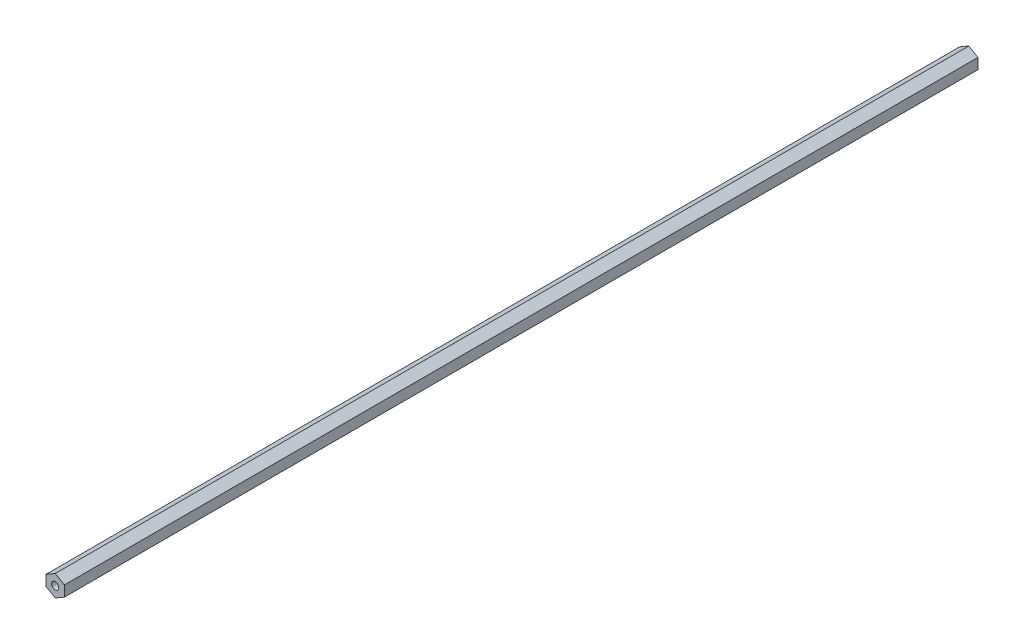
ISO-10303-21;
HEADER;
FILE_DESCRIPTION(('STEP AP214'),'2;1');
FILE_NAME('part.step','',(''),(''),'','','');
FILE_SCHEMA(('AUTOMOTIVE_DESIGN { 1 0 10303 214 1 1 1 1 }'));
ENDSEC;
DATA;
#1=APPLICATION_CONTEXT('core data for automotive mechanical design processes');
#2=APPLICATION_PROTOCOL_DEFINITION('international standard','automotive_design',2000,#1);
#3=PRODUCT_CONTEXT('',#1,'mechanical');
#4=PRODUCT('Part','Part','',(#3));
#5=PRODUCT_RELATED_PRODUCT_CATEGORY('part','',(#4));
#6=PRODUCT_DEFINITION_FORMATION('','',#4);
#7=PRODUCT_DEFINITION_CONTEXT('part definition',#1,'design');
#8=PRODUCT_DEFINITION('design','',#6,#7);
#9=PRODUCT_DEFINITION_SHAPE('','',#8);
#10=(LENGTH_UNIT() NAMED_UNIT(*) SI_UNIT(.MILLI.,.METRE.));
#11=(NAMED_UNIT(*) PLANE_ANGLE_UNIT() SI_UNIT($,.RADIAN.));
#12=(NAMED_UNIT(*) SI_UNIT($,.STERADIAN.) SOLID_ANGLE_UNIT());
#13=UNCERTAINTY_MEASURE_WITH_UNIT(LENGTH_MEASURE(1.E-05),#10,'distance_accuracy_value','');
#14=(GEOMETRIC_REPRESENTATION_CONTEXT(3) GLOBAL_UNCERTAINTY_ASSIGNED_CONTEXT((#13)) GLOBAL_UNIT_ASSIGNED_CONTEXT((#10,
#11,#12)) REPRESENTATION_CONTEXT('',''));
#15=CARTESIAN_POINT('',(0.,0.,0.));
#16=DIRECTION('',(0.,0.,1.));
#17=DIRECTION('',(1.,0.,0.));
#18=AXIS2_PLACEMENT_3D('',#15,#16,#17);
#19=CARTESIAN_POINT('',(0.,-7.33234841870825,315.9125));
#20=DIRECTION('',(-0.5,0.866025403784439,0.));
#21=DIRECTION('',(-0.866025403784439,-0.5,0.));
#22=AXIS2_PLACEMENT_3D('',#19,#20,#21);
#23=PLANE('',#22);
#24=DIRECTION('',(0.866025403784439,0.5,0.));
#25=VECTOR('',#24,1.);
#26=CARTESIAN_POINT('',(0.,-7.33234841870825,-315.9125));
#27=LINE('',#26,#25);
#28=CARTESIAN_POINT('',(0.,-7.33234841870825,-315.9125));
#29=VERTEX_POINT('',#28);
#30=CARTESIAN_POINT('',(6.35,-3.66617420935412,-315.9125));
#31=VERTEX_POINT('',#30);
#32=EDGE_CURVE('E125',#29,#31,#27,.T.);
#33=ORIENTED_EDGE('',*,*,#32,.T.);
#34=DIRECTION('',(0.,0.,-1.));
#35=VECTOR('',#34,1.);
#36=CARTESIAN_POINT('',(6.35,-3.66617420935412,315.9125));
#37=LINE('',#36,#35);
#38=CARTESIAN_POINT('',(6.35,-3.66617420935412,315.9125));
#39=VERTEX_POINT('',#38);
#40=EDGE_CURVE('E11',#39,#31,#37,.T.);
#41=ORIENTED_EDGE('',*,*,#40,.F.);
#42=DIRECTION('',(0.866025403784439,0.5,0.));
#43=VECTOR('',#42,1.);
#44=CARTESIAN_POINT('',(0.,-7.33234841870825,315.9125));
#45=LINE('',#44,#43);
#46=CARTESIAN_POINT('',(0.,-7.33234841870825,315.9125));
#47=VERTEX_POINT('',#46);
#48=EDGE_CURVE('E136',#47,#39,#45,.T.);
#49=ORIENTED_EDGE('',*,*,#48,.F.);
#50=DIRECTION('',(0.,0.,-1.));
#51=VECTOR('',#50,1.);
#52=CARTESIAN_POINT('',(0.,-7.33234841870825,315.9125));
#53=LINE('',#52,#51);
#54=EDGE_CURVE('E121',#47,#29,#53,.T.);
#55=ORIENTED_EDGE('',*,*,#54,.T.);
#56=EDGE_LOOP('',(#33,#41,#49,#55));
#57=FACE_BOUND('',#56,.T.);
#58=ADVANCED_FACE('F41',(#57),#23,.F.);
#59=CARTESIAN_POINT('',(6.35,-3.66617420935412,315.9125));
#60=DIRECTION('',(-1.,0.,0.));
#61=DIRECTION('',(0.,-1.,0.));
#62=AXIS2_PLACEMENT_3D('',#59,#60,#61);
#63=PLANE('',#62);
#64=DIRECTION('',(0.,1.,0.));
#65=VECTOR('',#64,1.);
#66=CARTESIAN_POINT('',(6.35,-3.66617420935412,-315.9125));
#67=LINE('',#66,#65);
#68=CARTESIAN_POINT('',(6.35,3.66617420935413,-315.9125));
#69=VERTEX_POINT('',#68);
#70=EDGE_CURVE('E128',#31,#69,#67,.T.);
#71=ORIENTED_EDGE('',*,*,#70,.T.);
#72=DIRECTION('',(0.,0.,-1.));
#73=VECTOR('',#72,1.);
#74=CARTESIAN_POINT('',(6.35,3.66617420935413,315.9125));
#75=LINE('',#74,#73);
#76=CARTESIAN_POINT('',(6.35,3.66617420935413,315.9125));
#77=VERTEX_POINT('',#76);
#78=EDGE_CURVE('E49',#77,#69,#75,.T.);
#79=ORIENTED_EDGE('',*,*,#78,.F.);
#80=DIRECTION('',(0.,1.,0.));
#81=VECTOR('',#80,1.);
#82=CARTESIAN_POINT('',(6.35,-3.66617420935412,315.9125));
#83=LINE('',#82,#81);
#84=EDGE_CURVE('E94',#39,#77,#83,.T.);
#85=ORIENTED_EDGE('',*,*,#84,.F.);
#86=ORIENTED_EDGE('',*,*,#40,.T.);
#87=EDGE_LOOP('',(#71,#79,#85,#86));
#88=FACE_BOUND('',#87,.T.);
#89=ADVANCED_FACE('F161',(#88),#63,.F.);
#90=CARTESIAN_POINT('',(6.35,3.66617420935413,315.9125));
#91=DIRECTION('',(-0.5,-0.866025403784439,0.));
#92=DIRECTION('',(0.866025403784439,-0.5,0.));
#93=AXIS2_PLACEMENT_3D('',#90,#91,#92);
#94=PLANE('',#93);
#95=DIRECTION('',(-0.866025403784439,0.5,0.));
#96=VECTOR('',#95,1.);
#97=CARTESIAN_POINT('',(6.35,3.66617420935413,-315.9125));
#98=LINE('',#97,#96);
#99=CARTESIAN_POINT('',(0.,7.33234841870825,-315.9125));
#100=VERTEX_POINT('',#99);
#101=EDGE_CURVE('E131',#69,#100,#98,.T.);
#102=ORIENTED_EDGE('',*,*,#101,.T.);
#103=DIRECTION('',(0.,0.,-1.));
#104=VECTOR('',#103,1.);
#105=CARTESIAN_POINT('',(0.,7.33234841870825,315.9125));
#106=LINE('',#105,#104);
#107=CARTESIAN_POINT('',(0.,7.33234841870825,315.9125));
#108=VERTEX_POINT('',#107);
#109=EDGE_CURVE('E116',#108,#100,#106,.T.);
#110=ORIENTED_EDGE('',*,*,#109,.F.);
#111=DIRECTION('',(-0.866025403784439,0.5,0.));
#112=VECTOR('',#111,1.);
#113=CARTESIAN_POINT('',(6.35,3.66617420935413,315.9125));
#114=LINE('',#113,#112);
#115=EDGE_CURVE('E107',#77,#108,#114,.T.);
#116=ORIENTED_EDGE('',*,*,#115,.F.);
#117=ORIENTED_EDGE('',*,*,#78,.T.);
#118=EDGE_LOOP('',(#102,#110,#116,#117));
#119=FACE_BOUND('',#118,.T.);
#120=ADVANCED_FACE('F142',(#119),#94,.F.);
#121=CARTESIAN_POINT('',(0.,7.33234841870825,315.9125));
#122=DIRECTION('',(0.5,-0.866025403784439,0.));
#123=DIRECTION('',(0.866025403784439,0.5,0.));
#124=AXIS2_PLACEMENT_3D('',#121,#122,#123);
#125=PLANE('',#124);
#126=DIRECTION('',(-0.866025403784439,-0.5,0.));
#127=VECTOR('',#126,1.);
#128=CARTESIAN_POINT('',(0.,7.33234841870825,-315.9125));
#129=LINE('',#128,#127);
#130=CARTESIAN_POINT('',(-6.35,3.66617420935413,-315.9125));
#131=VERTEX_POINT('',#130);
#132=EDGE_CURVE('E115',#100,#131,#129,.T.);
#133=ORIENTED_EDGE('',*,*,#132,.T.);
#134=DIRECTION('',(0.,0.,-1.));
#135=VECTOR('',#134,1.);
#136=CARTESIAN_POINT('',(-6.35,3.66617420935413,315.9125));
#137=LINE('',#136,#135);
#138=CARTESIAN_POINT('',(-6.35,3.66617420935413,315.9125));
#139=VERTEX_POINT('',#138);
#140=EDGE_CURVE('E112',#139,#131,#137,.T.);
#141=ORIENTED_EDGE('',*,*,#140,.F.);
#142=DIRECTION('',(-0.866025403784439,-0.5,0.));
#143=VECTOR('',#142,1.);
#144=CARTESIAN_POINT('',(0.,7.33234841870825,315.9125));
#145=LINE('',#144,#143);
#146=EDGE_CURVE('E101',#108,#139,#145,.T.);
#147=ORIENTED_EDGE('',*,*,#146,.F.);
#148=ORIENTED_EDGE('',*,*,#109,.T.);
#149=EDGE_LOOP('',(#133,#141,#147,#148));
#150=FACE_BOUND('',#149,.T.);
#151=ADVANCED_FACE('F113',(#150),#125,.F.);
#152=CARTESIAN_POINT('',(-6.35,3.66617420935413,315.9125));
#153=DIRECTION('',(1.,0.,0.));
#154=DIRECTION('',(0.,1.,0.));
#155=AXIS2_PLACEMENT_3D('',#152,#153,#154);
#156=PLANE('',#155);
#157=DIRECTION('',(0.,-1.,0.));
#158=VECTOR('',#157,1.);
#159=CARTESIAN_POINT('',(-6.35,3.66617420935413,-315.9125));
#160=LINE('',#159,#158);
#161=CARTESIAN_POINT('',(-6.35,-3.66617420935412,-315.9125));
#162=VERTEX_POINT('',#161);
#163=EDGE_CURVE('E80',#131,#162,#160,.T.);
#164=ORIENTED_EDGE('',*,*,#163,.T.);
#165=DIRECTION('',(0.,0.,-1.));
#166=VECTOR('',#165,1.);
#167=CARTESIAN_POINT('',(-6.35,-3.66617420935412,315.9125));
#168=LINE('',#167,#166);
#169=CARTESIAN_POINT('',(-6.35,-3.66617420935412,315.9125));
#170=VERTEX_POINT('',#169);
#171=EDGE_CURVE('E117',#170,#162,#168,.T.);
#172=ORIENTED_EDGE('',*,*,#171,.F.);
#173=DIRECTION('',(0.,-1.,0.));
#174=VECTOR('',#173,1.);
#175=CARTESIAN_POINT('',(-6.35,3.66617420935413,315.9125));
#176=LINE('',#175,#174);
#177=EDGE_CURVE('E105',#139,#170,#176,.T.);
#178=ORIENTED_EDGE('',*,*,#177,.F.);
#179=ORIENTED_EDGE('',*,*,#140,.T.);
#180=EDGE_LOOP('',(#164,#172,#178,#179));
#181=FACE_BOUND('',#180,.T.);
#182=ADVANCED_FACE('F119',(#181),#156,.F.);
#183=CARTESIAN_POINT('',(-6.35,-3.66617420935412,315.9125));
#184=DIRECTION('',(0.5,0.866025403784439,0.));
#185=DIRECTION('',(-0.866025403784439,0.5,0.));
#186=AXIS2_PLACEMENT_3D('',#183,#184,#185);
#187=PLANE('',#186);
#188=DIRECTION('',(0.866025403784439,-0.5,0.));
#189=VECTOR('',#188,1.);
#190=CARTESIAN_POINT('',(-6.35,-3.66617420935412,-315.9125));
#191=LINE('',#190,#189);
#192=EDGE_CURVE('E86',#162,#29,#191,.T.);
#193=ORIENTED_EDGE('',*,*,#192,.T.);
#194=ORIENTED_EDGE('',*,*,#54,.F.);
#195=DIRECTION('',(0.866025403784439,-0.5,0.));
#196=VECTOR('',#195,1.);
#197=CARTESIAN_POINT('',(-6.35,-3.66617420935412,315.9125));
#198=LINE('',#197,#196);
#199=EDGE_CURVE('E57',#170,#47,#198,.T.);
#200=ORIENTED_EDGE('',*,*,#199,.F.);
#201=ORIENTED_EDGE('',*,*,#171,.T.);
#202=EDGE_LOOP('',(#193,#194,#200,#201));
#203=FACE_BOUND('',#202,.T.);
#204=ADVANCED_FACE('F149',(#203),#187,.F.);
#205=CARTESIAN_POINT('',(0.,0.,315.9125));
#206=DIRECTION('',(0.,0.,1.));
#207=DIRECTION('',(1.,0.,0.));
#208=AXIS2_PLACEMENT_3D('',#205,#206,#207);
#209=PLANE('',#208);
#210=CARTESIAN_POINT('',(0.,0.,315.9125));
#211=DIRECTION('',(0.,0.,1.));
#212=DIRECTION('',(1.,0.,0.));
#213=AXIS2_PLACEMENT_3D('',#210,#211,#212);
#214=CIRCLE('',#213,2.4892);
#215=CARTESIAN_POINT('',(2.4892,0.,315.9125));
#216=VERTEX_POINT('',#215);
#217=EDGE_CURVE('E245',#216,#216,#214,.T.);
#218=ORIENTED_EDGE('',*,*,#217,.F.);
#219=EDGE_LOOP('',(#218));
#220=FACE_BOUND('',#219,.T.);
#221=ORIENTED_EDGE('',*,*,#48,.T.);
#222=ORIENTED_EDGE('',*,*,#84,.T.);
#223=ORIENTED_EDGE('',*,*,#115,.T.);
#224=ORIENTED_EDGE('',*,*,#146,.T.);
#225=ORIENTED_EDGE('',*,*,#177,.T.);
#226=ORIENTED_EDGE('',*,*,#199,.T.);
#227=EDGE_LOOP('',(#221,#222,#223,#224,#225,#226));
#228=FACE_BOUND('',#227,.T.);
#229=ADVANCED_FACE('F103',(#220,#228),#209,.T.);
#230=CARTESIAN_POINT('',(0.,0.,-315.9125));
#231=DIRECTION('',(0.,0.,1.));
#232=DIRECTION('',(1.,0.,0.));
#233=AXIS2_PLACEMENT_3D('',#230,#231,#232);
#234=PLANE('',#233);
#235=CARTESIAN_POINT('',(0.,0.,-315.9125));
#236=DIRECTION('',(0.,0.,1.));
#237=DIRECTION('',(1.,0.,0.));
#238=AXIS2_PLACEMENT_3D('',#235,#236,#237);
#239=CIRCLE('',#238,2.4892);
#240=CARTESIAN_POINT('',(-2.4892,0.,-315.9125));
#241=VERTEX_POINT('',#240);
#242=EDGE_CURVE('E246',#241,#241,#239,.T.);
#243=ORIENTED_EDGE('',*,*,#242,.T.);
#244=EDGE_LOOP('',(#243));
#245=FACE_BOUND('',#244,.T.);
#246=ORIENTED_EDGE('',*,*,#32,.F.);
#247=ORIENTED_EDGE('',*,*,#192,.F.);
#248=ORIENTED_EDGE('',*,*,#163,.F.);
#249=ORIENTED_EDGE('',*,*,#132,.F.);
#250=ORIENTED_EDGE('',*,*,#101,.F.);
#251=ORIENTED_EDGE('',*,*,#70,.F.);
#252=EDGE_LOOP('',(#246,#247,#248,#249,#250,#251));
#253=FACE_BOUND('',#252,.T.);
#254=ADVANCED_FACE('F145',(#245,#253),#234,.F.);
#255=CARTESIAN_POINT('',(0.,0.,296.8625));
#256=DIRECTION('',(0.,0.,1.));
#257=DIRECTION('',(1.,0.,0.));
#258=AXIS2_PLACEMENT_3D('',#255,#256,#257);
#259=CYLINDRICAL_SURFACE('',#258,2.4892);
#260=CARTESIAN_POINT('',(0.,0.,296.8625));
#261=DIRECTION('',(0.,0.,1.));
#262=DIRECTION('',(1.,0.,0.));
#263=AXIS2_PLACEMENT_3D('',#260,#261,#262);
#264=CIRCLE('',#263,2.4892);
#265=CARTESIAN_POINT('',(2.4892,0.,296.8625));
#266=VERTEX_POINT('',#265);
#267=EDGE_CURVE('E129',#266,#266,#264,.T.);
#268=CARTESIAN_POINT('',(2.4892,0.,296.8625));
#269=CARTESIAN_POINT('',(2.4892,0.,297.0609375));
#270=CARTESIAN_POINT('',(2.4892,0.,297.259375));
#271=CARTESIAN_POINT('',(2.4892,0.,297.65625));
#272=CARTESIAN_POINT('',(2.4892,0.,297.8546875));
#273=CARTESIAN_POINT('',(2.4892,0.,298.2515625));
#274=CARTESIAN_POINT('',(2.4892,0.,298.45));
#275=CARTESIAN_POINT('',(2.4892,0.,298.846875));
#276=CARTESIAN_POINT('',(2.4892,0.,299.0453125));
#277=CARTESIAN_POINT('',(2.4892,0.,299.4421875));
#278=CARTESIAN_POINT('',(2.4892,0.,299.640625));
#279=CARTESIAN_POINT('',(2.4892,0.,300.0375));
#280=CARTESIAN_POINT('',(2.4892,0.,300.2359375));
#281=CARTESIAN_POINT('',(2.4892,0.,300.6328125));
#282=CARTESIAN_POINT('',(2.4892,0.,300.83125));
#283=CARTESIAN_POINT('',(2.4892,0.,301.228125));
#284=CARTESIAN_POINT('',(2.4892,0.,301.4265625));
#285=CARTESIAN_POINT('',(2.4892,0.,301.8234375));
#286=CARTESIAN_POINT('',(2.4892,0.,302.021875));
#287=CARTESIAN_POINT('',(2.4892,0.,302.41875));
#288=CARTESIAN_POINT('',(2.4892,0.,302.6171875));
#289=CARTESIAN_POINT('',(2.4892,0.,303.0140625));
#290=CARTESIAN_POINT('',(2.4892,0.,303.2125));
#291=CARTESIAN_POINT('',(2.4892,0.,303.609375));
#292=CARTESIAN_POINT('',(2.4892,0.,303.8078125));
#293=CARTESIAN_POINT('',(2.4892,0.,304.2046875));
#294=CARTESIAN_POINT('',(2.4892,0.,304.403125));
#295=CARTESIAN_POINT('',(2.4892,0.,304.8));
#296=CARTESIAN_POINT('',(2.4892,0.,304.9984375));
#297=CARTESIAN_POINT('',(2.4892,0.,305.3953125));
#298=CARTESIAN_POINT('',(2.4892,0.,305.59375));
#299=CARTESIAN_POINT('',(2.4892,0.,305.990625));
#300=CARTESIAN_POINT('',(2.4892,0.,306.1890625));
#301=CARTESIAN_POINT('',(2.4892,0.,306.5859375));
#302=CARTESIAN_POINT('',(2.4892,0.,306.784375));
#303=CARTESIAN_POINT('',(2.4892,0.,307.18125));
#304=CARTESIAN_POINT('',(2.4892,0.,307.3796875));
#305=CARTESIAN_POINT('',(2.4892,0.,307.7765625));
#306=CARTESIAN_POINT('',(2.4892,0.,307.975));
#307=CARTESIAN_POINT('',(2.4892,0.,308.371875));
#308=CARTESIAN_POINT('',(2.4892,0.,308.5703125));
#309=CARTESIAN_POINT('',(2.4892,0.,308.9671875));
#310=CARTESIAN_POINT('',(2.4892,0.,309.165625));
#311=CARTESIAN_POINT('',(2.4892,0.,309.5625));
#312=CARTESIAN_POINT('',(2.4892,0.,309.7609375));
#313=CARTESIAN_POINT('',(2.4892,0.,310.1578125));
#314=CARTESIAN_POINT('',(2.4892,0.,310.35625));
#315=CARTESIAN_POINT('',(2.4892,0.,310.753125));
#316=CARTESIAN_POINT('',(2.4892,0.,310.9515625));
#317=CARTESIAN_POINT('',(2.4892,0.,311.3484375));
#318=CARTESIAN_POINT('',(2.4892,0.,311.546875));
#319=CARTESIAN_POINT('',(2.4892,0.,311.94375));
#320=CARTESIAN_POINT('',(2.4892,0.,312.1421875));
#321=CARTESIAN_POINT('',(2.4892,0.,312.5390625));
#322=CARTESIAN_POINT('',(2.4892,0.,312.7375));
#323=CARTESIAN_POINT('',(2.4892,0.,313.134375));
#324=CARTESIAN_POINT('',(2.4892,0.,313.3328125));
#325=CARTESIAN_POINT('',(2.4892,0.,313.7296875));
#326=CARTESIAN_POINT('',(2.4892,0.,313.928125));
#327=CARTESIAN_POINT('',(2.4892,0.,314.325));
#328=CARTESIAN_POINT('',(2.4892,0.,314.5234375));
#329=CARTESIAN_POINT('',(2.4892,0.,314.9203125));
#330=CARTESIAN_POINT('',(2.4892,0.,315.11875));
#331=CARTESIAN_POINT('',(2.4892,0.,315.515625));
#332=CARTESIAN_POINT('',(2.4892,0.,315.7140625));
#333=CARTESIAN_POINT('',(2.4892,0.,315.9125));
#334=B_SPLINE_CURVE_WITH_KNOTS('',3,(#268,#269,#270,#271,#272,#273,#274,#275,#276,#277,#278,
#279,#280,#281,#282,#283,#284,#285,#286,#287,#288,#289,#290,#291,#292,#293,#294,#295,#296,#297,
#298,#299,#300,#301,#302,#303,#304,#305,#306,#307,#308,#309,#310,#311,#312,#313,#314,#315,#316,
#317,#318,#319,#320,#321,#322,#323,#324,#325,#326,#327,#328,#329,#330,#331,#332,#333),
.UNSPECIFIED.,.F.,.F.,(4,2,2,2,2,2,2,2,2,2,2,2,2,2,2,2,2,2,2,2,2,2,2,2,2,2,2,2,2,2,2,2,4),(0.,
0.5953125,1.190625,1.7859375,2.38125,2.9765625,3.571875,4.1671875,4.7625,5.3578125,5.953125,
6.5484375,7.14375,7.7390625,8.334375,8.92968750000001,9.52500000000001,10.1203125,10.715625,
11.3109375,11.90625,12.5015625,13.096875,13.6921875,14.2875,14.8828125,15.478125,16.0734375,
16.66875,17.2640625,17.859375,18.4546875,19.05),.UNSPECIFIED.);
#335=EDGE_CURVE('BSEAM201',#266,#216,#334,.T.);
#336=ORIENTED_EDGE('',*,*,#267,.F.);
#337=ORIENTED_EDGE('',*,*,#217,.T.);
#338=ORIENTED_EDGE('',*,*,#335,.T.);
#339=ORIENTED_EDGE('',*,*,#335,.F.);
#340=EDGE_LOOP('',(#336,#338,#337,#339));
#341=FACE_BOUND('',#340,.T.);
#342=ADVANCED_FACE('F201',(#341),#259,.F.);
#343=CARTESIAN_POINT('',(0.,0.,296.8625));
#344=DIRECTION('',(0.,0.,1.));
#345=DIRECTION('',(1.,0.,0.));
#346=AXIS2_PLACEMENT_3D('',#343,#344,#345);
#347=PLANE('',#346);
#348=ORIENTED_EDGE('',*,*,#267,.T.);
#349=EDGE_LOOP('',(#348));
#350=FACE_BOUND('',#349,.T.);
#351=ADVANCED_FACE('F211',(#350),#347,.T.);
#352=CARTESIAN_POINT('',(0.,0.,-296.8625));
#353=DIRECTION('',(0.,0.,-1.));
#354=DIRECTION('',(-1.,0.,0.));
#355=AXIS2_PLACEMENT_3D('',#352,#353,#354);
#356=CYLINDRICAL_SURFACE('',#355,2.4892);
#357=CARTESIAN_POINT('',(0.,0.,-296.8625));
#358=DIRECTION('',(0.,0.,1.));
#359=DIRECTION('',(1.,0.,0.));
#360=AXIS2_PLACEMENT_3D('',#357,#358,#359);
#361=CIRCLE('',#360,2.4892);
#362=CARTESIAN_POINT('',(-2.4892,0.,-296.8625));
#363=VERTEX_POINT('',#362);
#364=EDGE_CURVE('E244',#363,#363,#361,.T.);
#365=CARTESIAN_POINT('',(-2.4892,0.,-296.8625));
#366=CARTESIAN_POINT('',(-2.4892,0.,-297.0609375));
#367=CARTESIAN_POINT('',(-2.4892,0.,-297.259375));
#368=CARTESIAN_POINT('',(-2.4892,0.,-297.65625));
#369=CARTESIAN_POINT('',(-2.4892,0.,-297.8546875));
#370=CARTESIAN_POINT('',(-2.4892,0.,-298.2515625));
#371=CARTESIAN_POINT('',(-2.4892,0.,-298.45));
#372=CARTESIAN_POINT('',(-2.4892,0.,-298.846875));
#373=CARTESIAN_POINT('',(-2.4892,0.,-299.0453125));
#374=CARTESIAN_POINT('',(-2.4892,0.,-299.4421875));
#375=CARTESIAN_POINT('',(-2.4892,0.,-299.640625));
#376=CARTESIAN_POINT('',(-2.4892,0.,-300.0375));
#377=CARTESIAN_POINT('',(-2.4892,0.,-300.2359375));
#378=CARTESIAN_POINT('',(-2.4892,0.,-300.6328125));
#379=CARTESIAN_POINT('',(-2.4892,0.,-300.83125));
#380=CARTESIAN_POINT('',(-2.4892,0.,-301.228125));
#381=CARTESIAN_POINT('',(-2.4892,0.,-301.4265625));
#382=CARTESIAN_POINT('',(-2.4892,0.,-301.8234375));
#383=CARTESIAN_POINT('',(-2.4892,0.,-302.021875));
#384=CARTESIAN_POINT('',(-2.4892,0.,-302.41875));
#385=CARTESIAN_POINT('',(-2.4892,0.,-302.6171875));
#386=CARTESIAN_POINT('',(-2.4892,0.,-303.0140625));
#387=CARTESIAN_POINT('',(-2.4892,0.,-303.2125));
#388=CARTESIAN_POINT('',(-2.4892,0.,-303.609375));
#389=CARTESIAN_POINT('',(-2.4892,0.,-303.8078125));
#390=CARTESIAN_POINT('',(-2.4892,0.,-304.2046875));
#391=CARTESIAN_POINT('',(-2.4892,0.,-304.403125));
#392=CARTESIAN_POINT('',(-2.4892,0.,-304.8));
#393=CARTESIAN_POINT('',(-2.4892,0.,-304.9984375));
#394=CARTESIAN_POINT('',(-2.4892,0.,-305.3953125));
#395=CARTESIAN_POINT('',(-2.4892,0.,-305.59375));
#396=CARTESIAN_POINT('',(-2.4892,0.,-305.990625));
#397=CARTESIAN_POINT('',(-2.4892,0.,-306.1890625));
#398=CARTESIAN_POINT('',(-2.4892,0.,-306.5859375));
#399=CARTESIAN_POINT('',(-2.4892,0.,-306.784375));
#400=CARTESIAN_POINT('',(-2.4892,0.,-307.18125));
#401=CARTESIAN_POINT('',(-2.4892,0.,-307.3796875));
#402=CARTESIAN_POINT('',(-2.4892,0.,-307.7765625));
#403=CARTESIAN_POINT('',(-2.4892,0.,-307.975));
#404=CARTESIAN_POINT('',(-2.4892,0.,-308.371875));
#405=CARTESIAN_POINT('',(-2.4892,0.,-308.5703125));
#406=CARTESIAN_POINT('',(-2.4892,0.,-308.9671875));
#407=CARTESIAN_POINT('',(-2.4892,0.,-309.165625));
#408=CARTESIAN_POINT('',(-2.4892,0.,-309.5625));
#409=CARTESIAN_POINT('',(-2.4892,0.,-309.7609375));
#410=CARTESIAN_POINT('',(-2.4892,0.,-310.1578125));
#411=CARTESIAN_POINT('',(-2.4892,0.,-310.35625));
#412=CARTESIAN_POINT('',(-2.4892,0.,-310.753125));
#413=CARTESIAN_POINT('',(-2.4892,0.,-310.9515625));
#414=CARTESIAN_POINT('',(-2.4892,0.,-311.3484375));
#415=CARTESIAN_POINT('',(-2.4892,0.,-311.546875));
#416=CARTESIAN_POINT('',(-2.4892,0.,-311.94375));
#417=CARTESIAN_POINT('',(-2.4892,0.,-312.1421875));
#418=CARTESIAN_POINT('',(-2.4892,0.,-312.5390625));
#419=CARTESIAN_POINT('',(-2.4892,0.,-312.7375));
#420=CARTESIAN_POINT('',(-2.4892,0.,-313.134375));
#421=CARTESIAN_POINT('',(-2.4892,0.,-313.3328125));
#422=CARTESIAN_POINT('',(-2.4892,0.,-313.7296875));
#423=CARTESIAN_POINT('',(-2.4892,0.,-313.928125));
#424=CARTESIAN_POINT('',(-2.4892,0.,-314.325));
#425=CARTESIAN_POINT('',(-2.4892,0.,-314.5234375));
#426=CARTESIAN_POINT('',(-2.4892,0.,-314.9203125));
#427=CARTESIAN_POINT('',(-2.4892,0.,-315.11875));
#428=CARTESIAN_POINT('',(-2.4892,0.,-315.515625));
#429=CARTESIAN_POINT('',(-2.4892,0.,-315.7140625));
#430=CARTESIAN_POINT('',(-2.4892,0.,-315.9125));
#431=B_SPLINE_CURVE_WITH_KNOTS('',3,(#365,#366,#367,#368,#369,#370,#371,#372,#373,#374,#375,
#376,#377,#378,#379,#380,#381,#382,#383,#384,#385,#386,#387,#388,#389,#390,#391,#392,#393,#394,
#395,#396,#397,#398,#399,#400,#401,#402,#403,#404,#405,#406,#407,#408,#409,#410,#411,#412,#413,
#414,#415,#416,#417,#418,#419,#420,#421,#422,#423,#424,#425,#426,#427,#428,#429,#430),
.UNSPECIFIED.,.F.,.F.,(4,2,2,2,2,2,2,2,2,2,2,2,2,2,2,2,2,2,2,2,2,2,2,2,2,2,2,2,2,2,2,2,4),(0.,
0.595312499999945,1.19062499999995,1.78593749999995,2.38124999999995,2.97656249999995,
3.57187499999995,4.16718749999995,4.76249999999995,5.35781249999995,5.95312499999995,
6.54843749999995,7.14374999999995,7.73906249999995,8.33437499999995,8.92968749999995,
9.52499999999995,10.1203125,10.715625,11.3109375,11.90625,12.5015625,13.096875,13.6921875,
14.2875,14.8828125,15.478125,16.0734375,16.66875,17.2640625,17.859375,18.4546875,19.05),.UNSPECIFIED.);
#432=EDGE_CURVE('BSEAM220',#363,#241,#431,.T.);
#433=ORIENTED_EDGE('',*,*,#364,.T.);
#434=ORIENTED_EDGE('',*,*,#242,.F.);
#435=ORIENTED_EDGE('',*,*,#432,.T.);
#436=ORIENTED_EDGE('',*,*,#432,.F.);
#437=EDGE_LOOP('',(#433,#435,#434,#436));
#438=FACE_BOUND('',#437,.T.);
#439=ADVANCED_FACE('F220',(#438),#356,.F.);
#440=CARTESIAN_POINT('',(0.,0.,-296.8625));
#441=DIRECTION('',(0.,0.,-1.));
#442=DIRECTION('',(1.,0.,0.));
#443=AXIS2_PLACEMENT_3D('',#440,#441,#442);
#444=PLANE('',#443);
#445=ORIENTED_EDGE('',*,*,#364,.F.);
#446=EDGE_LOOP('',(#445));
#447=FACE_BOUND('',#446,.T.);
#448=ADVANCED_FACE('F229',(#447),#444,.T.);
#449=CLOSED_SHELL('',(#58,#89,#120,#151,#182,#204,#229,#254,#342,#351,#439,#448));
#450=MANIFOLD_SOLID_BREP('B2',#449);
#451=ADVANCED_BREP_SHAPE_REPRESENTATION('',(#18,#450),#14);
#452=SHAPE_DEFINITION_REPRESENTATION(#9,#451);
ENDSEC;
END-ISO-10303-21;
